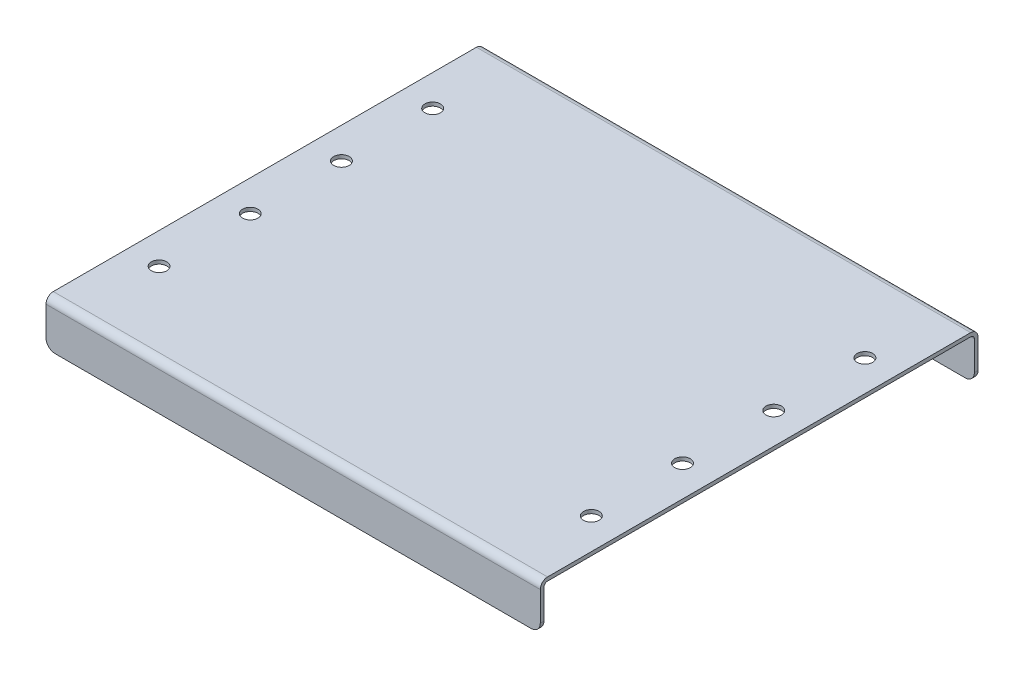
ISO-10303-21;
HEADER;
FILE_DESCRIPTION(('STEP AP214'),'2;1');
FILE_NAME('part.step','',(''),(''),'','','');
FILE_SCHEMA(('AUTOMOTIVE_DESIGN { 1 0 10303 214 1 1 1 1 }'));
ENDSEC;
DATA;
#1=APPLICATION_CONTEXT('core data for automotive mechanical design processes');
#2=APPLICATION_PROTOCOL_DEFINITION('international standard','automotive_design',2000,#1);
#3=PRODUCT_CONTEXT('',#1,'mechanical');
#4=PRODUCT('Part','Part','',(#3));
#5=PRODUCT_RELATED_PRODUCT_CATEGORY('part','',(#4));
#6=PRODUCT_DEFINITION_FORMATION('','',#4);
#7=PRODUCT_DEFINITION_CONTEXT('part definition',#1,'design');
#8=PRODUCT_DEFINITION('design','',#6,#7);
#9=PRODUCT_DEFINITION_SHAPE('','',#8);
#10=(LENGTH_UNIT() NAMED_UNIT(*) SI_UNIT(.MILLI.,.METRE.));
#11=(NAMED_UNIT(*) PLANE_ANGLE_UNIT() SI_UNIT($,.RADIAN.));
#12=(NAMED_UNIT(*) SI_UNIT($,.STERADIAN.) SOLID_ANGLE_UNIT());
#13=UNCERTAINTY_MEASURE_WITH_UNIT(LENGTH_MEASURE(1.E-05),#10,'distance_accuracy_value','');
#14=(GEOMETRIC_REPRESENTATION_CONTEXT(3) GLOBAL_UNCERTAINTY_ASSIGNED_CONTEXT((#13)) GLOBAL_UNIT_ASSIGNED_CONTEXT((#10,
#11,#12)) REPRESENTATION_CONTEXT('',''));
#15=CARTESIAN_POINT('',(0.,0.,0.));
#16=DIRECTION('',(0.,0.,1.));
#17=DIRECTION('',(1.,0.,0.));
#18=AXIS2_PLACEMENT_3D('',#15,#16,#17);
#19=CARTESIAN_POINT('',(0.,4.19953926706038E-13,-118.));
#20=DIRECTION('',(0.,0.,1.));
#21=DIRECTION('',(0.,-1.,0.));
#22=AXIS2_PLACEMENT_3D('',#19,#20,#21);
#23=PLANE('',#22);
#24=DIRECTION('',(0.,1.,0.));
#25=VECTOR('',#24,1.);
#26=CARTESIAN_POINT('',(135.5,-25.,-118.));
#27=LINE('',#26,#25);
#28=CARTESIAN_POINT('',(135.5,-20.,-118.));
#29=VERTEX_POINT('',#28);
#30=CARTESIAN_POINT('',(135.5,-3.99999999999999,-118.));
#31=VERTEX_POINT('',#30);
#32=EDGE_CURVE('E128',#29,#31,#27,.T.);
#33=ORIENTED_EDGE('',*,*,#32,.T.);
#34=DIRECTION('',(1.,0.,0.));
#35=VECTOR('',#34,1.);
#36=CARTESIAN_POINT('',(135.5,-4.,-118.));
#37=LINE('',#36,#35);
#38=CARTESIAN_POINT('',(-135.5,-4.,-118.));
#39=VERTEX_POINT('',#38);
#40=EDGE_CURVE('E271',#31,#39,#37,.F.);
#41=ORIENTED_EDGE('',*,*,#40,.T.);
#42=DIRECTION('',(0.,1.,0.));
#43=VECTOR('',#42,1.);
#44=CARTESIAN_POINT('',(-135.5,-1.99999999999999,-118.));
#45=LINE('',#44,#43);
#46=CARTESIAN_POINT('',(-135.5,-20.,-118.));
#47=VERTEX_POINT('',#46);
#48=EDGE_CURVE('E262',#39,#47,#45,.F.);
#49=ORIENTED_EDGE('',*,*,#48,.T.);
#50=CARTESIAN_POINT('',(-130.5,-20.,-118.));
#51=DIRECTION('',(0.,0.,1.));
#52=DIRECTION('',(0.,-1.,0.));
#53=AXIS2_PLACEMENT_3D('',#50,#51,#52);
#54=CIRCLE('',#53,5.);
#55=CARTESIAN_POINT('',(-130.5,-25.,-118.));
#56=VERTEX_POINT('',#55);
#57=EDGE_CURVE('E136',#56,#47,#54,.F.);
#58=ORIENTED_EDGE('',*,*,#57,.F.);
#59=DIRECTION('',(1.,0.,0.));
#60=VECTOR('',#59,1.);
#61=CARTESIAN_POINT('',(-135.5,-25.,-118.));
#62=LINE('',#61,#60);
#63=CARTESIAN_POINT('',(130.5,-25.,-118.));
#64=VERTEX_POINT('',#63);
#65=EDGE_CURVE('E131',#56,#64,#62,.T.);
#66=ORIENTED_EDGE('',*,*,#65,.T.);
#67=CARTESIAN_POINT('',(130.5,-20.,-118.));
#68=DIRECTION('',(0.,0.,1.));
#69=DIRECTION('',(0.,-1.,0.));
#70=AXIS2_PLACEMENT_3D('',#67,#68,#69);
#71=CIRCLE('',#70,5.);
#72=EDGE_CURVE('E19',#29,#64,#71,.F.);
#73=ORIENTED_EDGE('',*,*,#72,.F.);
#74=EDGE_LOOP('',(#33,#41,#49,#58,#66,#73));
#75=FACE_BOUND('',#74,.T.);
#76=ADVANCED_FACE('F16',(#75),#23,.T.);
#77=CARTESIAN_POINT('',(0.,4.19953926706037E-13,118.));
#78=DIRECTION('',(0.,0.,-1.));
#79=DIRECTION('',(0.,1.,0.));
#80=AXIS2_PLACEMENT_3D('',#77,#78,#79);
#81=PLANE('',#80);
#82=DIRECTION('',(0.,1.,0.));
#83=VECTOR('',#82,1.);
#84=CARTESIAN_POINT('',(-135.5,-25.,118.));
#85=LINE('',#84,#83);
#86=CARTESIAN_POINT('',(-135.5,-20.,118.));
#87=VERTEX_POINT('',#86);
#88=CARTESIAN_POINT('',(-135.5,-3.99999999999999,118.));
#89=VERTEX_POINT('',#88);
#90=EDGE_CURVE('E259',#87,#89,#85,.T.);
#91=ORIENTED_EDGE('',*,*,#90,.T.);
#92=DIRECTION('',(-1.,0.,0.));
#93=VECTOR('',#92,1.);
#94=CARTESIAN_POINT('',(-135.5,-3.99999999999999,118.));
#95=LINE('',#94,#93);
#96=CARTESIAN_POINT('',(135.5,-3.99999999999998,118.));
#97=VERTEX_POINT('',#96);
#98=EDGE_CURVE('E245',#89,#97,#95,.F.);
#99=ORIENTED_EDGE('',*,*,#98,.T.);
#100=DIRECTION('',(0.,1.,0.));
#101=VECTOR('',#100,1.);
#102=CARTESIAN_POINT('',(135.5,-1.99999999999999,118.));
#103=LINE('',#102,#101);
#104=CARTESIAN_POINT('',(135.5,-20.,118.));
#105=VERTEX_POINT('',#104);
#106=EDGE_CURVE('E159',#97,#105,#103,.F.);
#107=ORIENTED_EDGE('',*,*,#106,.T.);
#108=CARTESIAN_POINT('',(130.5,-20.,118.));
#109=DIRECTION('',(0.,0.,-1.));
#110=DIRECTION('',(0.,1.,0.));
#111=AXIS2_PLACEMENT_3D('',#108,#109,#110);
#112=CIRCLE('',#111,5.);
#113=CARTESIAN_POINT('',(130.5,-25.,118.));
#114=VERTEX_POINT('',#113);
#115=EDGE_CURVE('E246',#114,#105,#112,.F.);
#116=ORIENTED_EDGE('',*,*,#115,.F.);
#117=DIRECTION('',(1.,0.,0.));
#118=VECTOR('',#117,1.);
#119=CARTESIAN_POINT('',(135.5,-25.,118.));
#120=LINE('',#119,#118);
#121=CARTESIAN_POINT('',(-130.5,-25.,118.));
#122=VERTEX_POINT('',#121);
#123=EDGE_CURVE('E157',#114,#122,#120,.F.);
#124=ORIENTED_EDGE('',*,*,#123,.T.);
#125=CARTESIAN_POINT('',(-130.5,-20.,118.));
#126=DIRECTION('',(0.,0.,-1.));
#127=DIRECTION('',(0.,1.,0.));
#128=AXIS2_PLACEMENT_3D('',#125,#126,#127);
#129=CIRCLE('',#128,5.);
#130=EDGE_CURVE('E145',#87,#122,#129,.F.);
#131=ORIENTED_EDGE('',*,*,#130,.F.);
#132=EDGE_LOOP('',(#91,#99,#107,#116,#124,#131));
#133=FACE_BOUND('',#132,.T.);
#134=ADVANCED_FACE('F316',(#133),#81,.T.);
#135=CARTESIAN_POINT('',(130.5,-20.,-120.));
#136=DIRECTION('',(0.,0.,1.));
#137=DIRECTION('',(0.,-1.,0.));
#138=AXIS2_PLACEMENT_3D('',#135,#136,#137);
#139=CYLINDRICAL_SURFACE('',#138,5.);
#140=ORIENTED_EDGE('',*,*,#72,.T.);
#141=DIRECTION('',(0.,0.,1.));
#142=VECTOR('',#141,1.);
#143=CARTESIAN_POINT('',(130.5,-25.,-120.));
#144=LINE('',#143,#142);
#145=CARTESIAN_POINT('',(130.5,-25.,-120.));
#146=VERTEX_POINT('',#145);
#147=EDGE_CURVE('E249',#64,#146,#144,.F.);
#148=ORIENTED_EDGE('',*,*,#147,.T.);
#149=CARTESIAN_POINT('',(130.5,-20.,-120.));
#150=DIRECTION('',(0.,0.,1.));
#151=DIRECTION('',(0.,-1.,0.));
#152=AXIS2_PLACEMENT_3D('',#149,#150,#151);
#153=CIRCLE('',#152,5.);
#154=CARTESIAN_POINT('',(135.5,-20.,-120.));
#155=VERTEX_POINT('',#154);
#156=EDGE_CURVE('E149',#146,#155,#153,.T.);
#157=ORIENTED_EDGE('',*,*,#156,.T.);
#158=DIRECTION('',(0.,0.,1.));
#159=VECTOR('',#158,1.);
#160=CARTESIAN_POINT('',(135.5,-20.,-120.));
#161=LINE('',#160,#159);
#162=EDGE_CURVE('E141',#155,#29,#161,.T.);
#163=ORIENTED_EDGE('',*,*,#162,.T.);
#164=EDGE_LOOP('',(#140,#148,#157,#163));
#165=FACE_BOUND('',#164,.T.);
#166=ADVANCED_FACE('F148',(#165),#139,.T.);
#167=CARTESIAN_POINT('',(-130.5,-20.,-120.));
#168=DIRECTION('',(0.,0.,1.));
#169=DIRECTION('',(0.,-1.,0.));
#170=AXIS2_PLACEMENT_3D('',#167,#168,#169);
#171=CYLINDRICAL_SURFACE('',#170,5.);
#172=ORIENTED_EDGE('',*,*,#57,.T.);
#173=DIRECTION('',(0.,0.,-1.));
#174=VECTOR('',#173,1.);
#175=CARTESIAN_POINT('',(-135.5,-20.,-120.));
#176=LINE('',#175,#174);
#177=CARTESIAN_POINT('',(-135.5,-20.,-120.));
#178=VERTEX_POINT('',#177);
#179=EDGE_CURVE('E155',#47,#178,#176,.T.);
#180=ORIENTED_EDGE('',*,*,#179,.T.);
#181=CARTESIAN_POINT('',(-130.5,-20.,-120.));
#182=DIRECTION('',(0.,0.,1.));
#183=DIRECTION('',(0.,-1.,0.));
#184=AXIS2_PLACEMENT_3D('',#181,#182,#183);
#185=CIRCLE('',#184,5.);
#186=CARTESIAN_POINT('',(-130.5,-25.,-120.));
#187=VERTEX_POINT('',#186);
#188=EDGE_CURVE('E239',#178,#187,#185,.T.);
#189=ORIENTED_EDGE('',*,*,#188,.T.);
#190=DIRECTION('',(0.,0.,1.));
#191=VECTOR('',#190,1.);
#192=CARTESIAN_POINT('',(-130.5,-25.,-120.));
#193=LINE('',#192,#191);
#194=EDGE_CURVE('E151',#187,#56,#193,.T.);
#195=ORIENTED_EDGE('',*,*,#194,.T.);
#196=EDGE_LOOP('',(#172,#180,#189,#195));
#197=FACE_BOUND('',#196,.T.);
#198=ADVANCED_FACE('F345',(#197),#171,.T.);
#199=CARTESIAN_POINT('',(-135.5,-25.,-120.));
#200=DIRECTION('',(0.,1.,0.));
#201=DIRECTION('',(0.,0.,1.));
#202=AXIS2_PLACEMENT_3D('',#199,#200,#201);
#203=PLANE('',#202);
#204=ORIENTED_EDGE('',*,*,#194,.F.);
#205=DIRECTION('',(1.,0.,0.));
#206=VECTOR('',#205,1.);
#207=CARTESIAN_POINT('',(0.,-25.,-120.));
#208=LINE('',#207,#206);
#209=EDGE_CURVE('E238',#187,#146,#208,.T.);
#210=ORIENTED_EDGE('',*,*,#209,.T.);
#211=ORIENTED_EDGE('',*,*,#147,.F.);
#212=ORIENTED_EDGE('',*,*,#65,.F.);
#213=EDGE_LOOP('',(#204,#210,#211,#212));
#214=FACE_BOUND('',#213,.T.);
#215=ADVANCED_FACE('F347',(#214),#203,.F.);
#216=CARTESIAN_POINT('',(-130.5,-20.,120.));
#217=DIRECTION('',(0.,0.,-1.));
#218=DIRECTION('',(0.,1.,0.));
#219=AXIS2_PLACEMENT_3D('',#216,#217,#218);
#220=CYLINDRICAL_SURFACE('',#219,5.);
#221=ORIENTED_EDGE('',*,*,#130,.T.);
#222=DIRECTION('',(0.,0.,1.));
#223=VECTOR('',#222,1.);
#224=CARTESIAN_POINT('',(-130.5,-25.,120.));
#225=LINE('',#224,#223);
#226=CARTESIAN_POINT('',(-130.5,-25.,120.));
#227=VERTEX_POINT('',#226);
#228=EDGE_CURVE('E248',#122,#227,#225,.T.);
#229=ORIENTED_EDGE('',*,*,#228,.T.);
#230=CARTESIAN_POINT('',(-130.5,-20.,120.));
#231=DIRECTION('',(0.,0.,-1.));
#232=DIRECTION('',(0.,1.,0.));
#233=AXIS2_PLACEMENT_3D('',#230,#231,#232);
#234=CIRCLE('',#233,5.);
#235=CARTESIAN_POINT('',(-135.5,-20.,120.));
#236=VERTEX_POINT('',#235);
#237=EDGE_CURVE('E233',#227,#236,#234,.T.);
#238=ORIENTED_EDGE('',*,*,#237,.T.);
#239=DIRECTION('',(0.,0.,-1.));
#240=VECTOR('',#239,1.);
#241=CARTESIAN_POINT('',(-135.5,-20.,120.));
#242=LINE('',#241,#240);
#243=EDGE_CURVE('E256',#236,#87,#242,.T.);
#244=ORIENTED_EDGE('',*,*,#243,.T.);
#245=EDGE_LOOP('',(#221,#229,#238,#244));
#246=FACE_BOUND('',#245,.T.);
#247=ADVANCED_FACE('F319',(#246),#220,.T.);
#248=CARTESIAN_POINT('',(130.5,-20.,120.));
#249=DIRECTION('',(0.,0.,-1.));
#250=DIRECTION('',(0.,1.,0.));
#251=AXIS2_PLACEMENT_3D('',#248,#249,#250);
#252=CYLINDRICAL_SURFACE('',#251,5.);
#253=ORIENTED_EDGE('',*,*,#115,.T.);
#254=DIRECTION('',(0.,0.,1.));
#255=VECTOR('',#254,1.);
#256=CARTESIAN_POINT('',(135.5,-20.,120.));
#257=LINE('',#256,#255);
#258=CARTESIAN_POINT('',(135.5,-20.,120.));
#259=VERTEX_POINT('',#258);
#260=EDGE_CURVE('E260',#105,#259,#257,.T.);
#261=ORIENTED_EDGE('',*,*,#260,.T.);
#262=CARTESIAN_POINT('',(130.5,-20.,120.));
#263=DIRECTION('',(0.,0.,-1.));
#264=DIRECTION('',(0.,1.,0.));
#265=AXIS2_PLACEMENT_3D('',#262,#263,#264);
#266=CIRCLE('',#265,5.);
#267=CARTESIAN_POINT('',(130.5,-25.,120.));
#268=VERTEX_POINT('',#267);
#269=EDGE_CURVE('E229',#259,#268,#266,.T.);
#270=ORIENTED_EDGE('',*,*,#269,.T.);
#271=DIRECTION('',(0.,0.,1.));
#272=VECTOR('',#271,1.);
#273=CARTESIAN_POINT('',(130.5,-25.,120.));
#274=LINE('',#273,#272);
#275=EDGE_CURVE('E160',#268,#114,#274,.F.);
#276=ORIENTED_EDGE('',*,*,#275,.T.);
#277=EDGE_LOOP('',(#253,#261,#270,#276));
#278=FACE_BOUND('',#277,.T.);
#279=ADVANCED_FACE('F355',(#278),#252,.T.);
#280=CARTESIAN_POINT('',(135.5,-25.,120.));
#281=DIRECTION('',(0.,1.,0.));
#282=DIRECTION('',(0.,0.,1.));
#283=AXIS2_PLACEMENT_3D('',#280,#281,#282);
#284=PLANE('',#283);
#285=ORIENTED_EDGE('',*,*,#275,.F.);
#286=DIRECTION('',(1.,0.,0.));
#287=VECTOR('',#286,1.);
#288=CARTESIAN_POINT('',(0.,-25.,120.));
#289=LINE('',#288,#287);
#290=EDGE_CURVE('E228',#268,#227,#289,.F.);
#291=ORIENTED_EDGE('',*,*,#290,.T.);
#292=ORIENTED_EDGE('',*,*,#228,.F.);
#293=ORIENTED_EDGE('',*,*,#123,.F.);
#294=EDGE_LOOP('',(#285,#291,#292,#293));
#295=FACE_BOUND('',#294,.T.);
#296=ADVANCED_FACE('F419',(#295),#284,.F.);
#297=CARTESIAN_POINT('',(135.5,-4.,-116.));
#298=DIRECTION('',(1.,0.,0.));
#299=DIRECTION('',(0.,0.,-1.));
#300=AXIS2_PLACEMENT_3D('',#297,#298,#299);
#301=CYLINDRICAL_SURFACE('',#300,1.99999999999997);
#302=CARTESIAN_POINT('',(-135.5,-4.,-116.));
#303=DIRECTION('',(1.,0.,0.));
#304=DIRECTION('',(0.,0.,-1.));
#305=AXIS2_PLACEMENT_3D('',#302,#303,#304);
#306=CIRCLE('',#305,1.99999999999997);
#307=CARTESIAN_POINT('',(-135.5,-2.00000000000001,-116.));
#308=VERTEX_POINT('',#307);
#309=EDGE_CURVE('E224',#39,#308,#306,.T.);
#310=ORIENTED_EDGE('',*,*,#309,.F.);
#311=ORIENTED_EDGE('',*,*,#40,.F.);
#312=CARTESIAN_POINT('',(135.5,-4.,-116.));
#313=DIRECTION('',(1.,0.,0.));
#314=DIRECTION('',(0.,0.,-1.));
#315=AXIS2_PLACEMENT_3D('',#312,#313,#314);
#316=CIRCLE('',#315,1.99999999999997);
#317=CARTESIAN_POINT('',(135.5,-2.00000000000001,-116.));
#318=VERTEX_POINT('',#317);
#319=EDGE_CURVE('E144',#31,#318,#316,.T.);
#320=ORIENTED_EDGE('',*,*,#319,.T.);
#321=DIRECTION('',(1.,0.,0.));
#322=VECTOR('',#321,1.);
#323=CARTESIAN_POINT('',(0.,-2.,-116.));
#324=LINE('',#323,#322);
#325=EDGE_CURVE('E223',#308,#318,#324,.T.);
#326=ORIENTED_EDGE('',*,*,#325,.F.);
#327=EDGE_LOOP('',(#310,#311,#320,#326));
#328=FACE_BOUND('',#327,.T.);
#329=ADVANCED_FACE('F416',(#328),#301,.F.);
#330=CARTESIAN_POINT('',(-135.5,-3.99999999999999,116.));
#331=DIRECTION('',(-1.,0.,0.));
#332=DIRECTION('',(0.,0.,1.));
#333=AXIS2_PLACEMENT_3D('',#330,#331,#332);
#334=CYLINDRICAL_SURFACE('',#333,1.99999999999997);
#335=CARTESIAN_POINT('',(135.5,-3.99999999999999,116.));
#336=DIRECTION('',(-1.,0.,0.));
#337=DIRECTION('',(0.,0.,1.));
#338=AXIS2_PLACEMENT_3D('',#335,#336,#337);
#339=CIRCLE('',#338,1.99999999999997);
#340=CARTESIAN_POINT('',(135.5,-2.00000000000001,116.));
#341=VERTEX_POINT('',#340);
#342=EDGE_CURVE('E226',#97,#341,#339,.T.);
#343=ORIENTED_EDGE('',*,*,#342,.F.);
#344=ORIENTED_EDGE('',*,*,#98,.F.);
#345=CARTESIAN_POINT('',(-135.5,-3.99999999999999,116.));
#346=DIRECTION('',(-1.,0.,0.));
#347=DIRECTION('',(0.,0.,1.));
#348=AXIS2_PLACEMENT_3D('',#345,#346,#347);
#349=CIRCLE('',#348,1.99999999999997);
#350=CARTESIAN_POINT('',(-135.5,-2.00000000000001,116.));
#351=VERTEX_POINT('',#350);
#352=EDGE_CURVE('E220',#89,#351,#349,.T.);
#353=ORIENTED_EDGE('',*,*,#352,.T.);
#354=DIRECTION('',(1.,0.,0.));
#355=VECTOR('',#354,1.);
#356=CARTESIAN_POINT('',(0.,-2.,116.));
#357=LINE('',#356,#355);
#358=EDGE_CURVE('E219',#341,#351,#357,.F.);
#359=ORIENTED_EDGE('',*,*,#358,.F.);
#360=EDGE_LOOP('',(#343,#344,#353,#359));
#361=FACE_BOUND('',#360,.T.);
#362=ADVANCED_FACE('F313',(#361),#334,.F.);
#363=CARTESIAN_POINT('',(0.,4.26936889383724E-13,-120.));
#364=DIRECTION('',(0.,0.,1.));
#365=DIRECTION('',(0.,-1.,0.));
#366=AXIS2_PLACEMENT_3D('',#363,#364,#365);
#367=PLANE('',#366);
#368=ORIENTED_EDGE('',*,*,#188,.F.);
#369=DIRECTION('',(0.,-1.,0.));
#370=VECTOR('',#369,1.);
#371=CARTESIAN_POINT('',(-135.5,4.26936889383724E-13,-120.));
#372=LINE('',#371,#370);
#373=CARTESIAN_POINT('',(-135.5,-4.,-120.));
#374=VERTEX_POINT('',#373);
#375=EDGE_CURVE('E242',#374,#178,#372,.T.);
#376=ORIENTED_EDGE('',*,*,#375,.F.);
#377=DIRECTION('',(1.,0.,0.));
#378=VECTOR('',#377,1.);
#379=CARTESIAN_POINT('',(135.5,-4.,-120.));
#380=LINE('',#379,#378);
#381=CARTESIAN_POINT('',(135.5,-3.99999999999999,-120.));
#382=VERTEX_POINT('',#381);
#383=EDGE_CURVE('E204',#382,#374,#380,.F.);
#384=ORIENTED_EDGE('',*,*,#383,.F.);
#385=DIRECTION('',(0.,-1.,0.));
#386=VECTOR('',#385,1.);
#387=CARTESIAN_POINT('',(135.5,4.26936889383724E-13,-120.));
#388=LINE('',#387,#386);
#389=EDGE_CURVE('E244',#155,#382,#388,.F.);
#390=ORIENTED_EDGE('',*,*,#389,.F.);
#391=ORIENTED_EDGE('',*,*,#156,.F.);
#392=ORIENTED_EDGE('',*,*,#209,.F.);
#393=EDGE_LOOP('',(#368,#376,#384,#390,#391,#392));
#394=FACE_BOUND('',#393,.T.);
#395=ADVANCED_FACE('F343',(#394),#367,.F.);
#396=CARTESIAN_POINT('',(0.,4.26936889383723E-13,120.));
#397=DIRECTION('',(0.,0.,-1.));
#398=DIRECTION('',(0.,1.,0.));
#399=AXIS2_PLACEMENT_3D('',#396,#397,#398);
#400=PLANE('',#399);
#401=ORIENTED_EDGE('',*,*,#269,.F.);
#402=DIRECTION('',(0.,1.,0.));
#403=VECTOR('',#402,1.);
#404=CARTESIAN_POINT('',(135.5,4.26936889383723E-13,120.));
#405=LINE('',#404,#403);
#406=CARTESIAN_POINT('',(135.5,-3.99999999999998,120.));
#407=VERTEX_POINT('',#406);
#408=EDGE_CURVE('E232',#407,#259,#405,.F.);
#409=ORIENTED_EDGE('',*,*,#408,.F.);
#410=DIRECTION('',(-1.,0.,0.));
#411=VECTOR('',#410,1.);
#412=CARTESIAN_POINT('',(-135.5,-3.99999999999999,120.));
#413=LINE('',#412,#411);
#414=CARTESIAN_POINT('',(-135.5,-3.99999999999998,120.));
#415=VERTEX_POINT('',#414);
#416=EDGE_CURVE('E199',#415,#407,#413,.F.);
#417=ORIENTED_EDGE('',*,*,#416,.F.);
#418=DIRECTION('',(0.,1.,0.));
#419=VECTOR('',#418,1.);
#420=CARTESIAN_POINT('',(-135.5,4.26936889383724E-13,120.));
#421=LINE('',#420,#419);
#422=EDGE_CURVE('E236',#236,#415,#421,.T.);
#423=ORIENTED_EDGE('',*,*,#422,.F.);
#424=ORIENTED_EDGE('',*,*,#237,.F.);
#425=ORIENTED_EDGE('',*,*,#290,.F.);
#426=EDGE_LOOP('',(#401,#409,#417,#423,#424,#425));
#427=FACE_BOUND('',#426,.T.);
#428=ADVANCED_FACE('F324',(#427),#400,.F.);
#429=CARTESIAN_POINT('',(0.,-2.,0.));
#430=DIRECTION('',(0.,-1.,0.));
#431=DIRECTION('',(0.,0.,-1.));
#432=AXIS2_PLACEMENT_3D('',#429,#430,#431);
#433=PLANE('',#432);
#434=CARTESIAN_POINT('',(118.5,-2.,75.));
#435=DIRECTION('',(0.,1.,0.));
#436=DIRECTION('',(0.,0.,1.));
#437=AXIS2_PLACEMENT_3D('',#434,#435,#436);
#438=CIRCLE('',#437,4.25);
#439=CARTESIAN_POINT('',(118.5,-2.,79.25));
#440=VERTEX_POINT('',#439);
#441=EDGE_CURVE('E184',#440,#440,#438,.T.);
#442=ORIENTED_EDGE('',*,*,#441,.T.);
#443=EDGE_LOOP('',(#442));
#444=FACE_BOUND('',#443,.T.);
#445=CARTESIAN_POINT('',(118.5,-2.,-25.));
#446=DIRECTION('',(0.,1.,0.));
#447=DIRECTION('',(0.,0.,1.));
#448=AXIS2_PLACEMENT_3D('',#445,#446,#447);
#449=CIRCLE('',#448,4.24999999999995);
#450=CARTESIAN_POINT('',(118.5,-2.,-20.7500000000001));
#451=VERTEX_POINT('',#450);
#452=EDGE_CURVE('E190',#451,#451,#449,.T.);
#453=ORIENTED_EDGE('',*,*,#452,.T.);
#454=EDGE_LOOP('',(#453));
#455=FACE_BOUND('',#454,.T.);
#456=DIRECTION('',(0.,0.,-1.));
#457=VECTOR('',#456,1.);
#458=CARTESIAN_POINT('',(135.5,-2.00000000000002,-116.));
#459=LINE('',#458,#457);
#460=EDGE_CURVE('E201',#341,#318,#459,.T.);
#461=ORIENTED_EDGE('',*,*,#460,.F.);
#462=ORIENTED_EDGE('',*,*,#358,.T.);
#463=DIRECTION('',(0.,0.,1.));
#464=VECTOR('',#463,1.);
#465=CARTESIAN_POINT('',(-135.5,-2.00000000000003,-116.));
#466=LINE('',#465,#464);
#467=EDGE_CURVE('E196',#308,#351,#466,.T.);
#468=ORIENTED_EDGE('',*,*,#467,.F.);
#469=ORIENTED_EDGE('',*,*,#325,.T.);
#470=EDGE_LOOP('',(#461,#462,#468,#469));
#471=FACE_BOUND('',#470,.T.);
#472=CARTESIAN_POINT('',(-118.5,-2.,25.));
#473=DIRECTION('',(0.,1.,0.));
#474=DIRECTION('',(0.,0.,1.));
#475=AXIS2_PLACEMENT_3D('',#472,#473,#474);
#476=CIRCLE('',#475,4.24999999999995);
#477=CARTESIAN_POINT('',(-118.5,-2.,29.25));
#478=VERTEX_POINT('',#477);
#479=EDGE_CURVE('E207',#478,#478,#476,.T.);
#480=ORIENTED_EDGE('',*,*,#479,.T.);
#481=EDGE_LOOP('',(#480));
#482=FACE_BOUND('',#481,.T.);
#483=CARTESIAN_POINT('',(-118.5,-2.,-25.));
#484=DIRECTION('',(0.,1.,0.));
#485=DIRECTION('',(0.,0.,1.));
#486=AXIS2_PLACEMENT_3D('',#483,#484,#485);
#487=CIRCLE('',#486,4.24999999999995);
#488=CARTESIAN_POINT('',(-118.5,-2.,-20.7500000000001));
#489=VERTEX_POINT('',#488);
#490=EDGE_CURVE('E210',#489,#489,#487,.T.);
#491=ORIENTED_EDGE('',*,*,#490,.T.);
#492=EDGE_LOOP('',(#491));
#493=FACE_BOUND('',#492,.T.);
#494=CARTESIAN_POINT('',(-118.5,-2.,-75.));
#495=DIRECTION('',(0.,1.,0.));
#496=DIRECTION('',(0.,0.,1.));
#497=AXIS2_PLACEMENT_3D('',#494,#495,#496);
#498=CIRCLE('',#497,4.25);
#499=CARTESIAN_POINT('',(-118.5,-2.,-70.75));
#500=VERTEX_POINT('',#499);
#501=EDGE_CURVE('E213',#500,#500,#498,.T.);
#502=ORIENTED_EDGE('',*,*,#501,.T.);
#503=EDGE_LOOP('',(#502));
#504=FACE_BOUND('',#503,.T.);
#505=CARTESIAN_POINT('',(-118.5,-2.,75.));
#506=DIRECTION('',(0.,1.,0.));
#507=DIRECTION('',(0.,0.,1.));
#508=AXIS2_PLACEMENT_3D('',#505,#506,#507);
#509=CIRCLE('',#508,4.25);
#510=CARTESIAN_POINT('',(-118.5,-2.,79.25));
#511=VERTEX_POINT('',#510);
#512=EDGE_CURVE('E216',#511,#511,#509,.T.);
#513=ORIENTED_EDGE('',*,*,#512,.T.);
#514=EDGE_LOOP('',(#513));
#515=FACE_BOUND('',#514,.T.);
#516=CARTESIAN_POINT('',(118.5,-2.,25.));
#517=DIRECTION('',(0.,1.,0.));
#518=DIRECTION('',(0.,0.,1.));
#519=AXIS2_PLACEMENT_3D('',#516,#517,#518);
#520=CIRCLE('',#519,4.24999999999995);
#521=CARTESIAN_POINT('',(118.5,-2.,29.25));
#522=VERTEX_POINT('',#521);
#523=EDGE_CURVE('E193',#522,#522,#520,.T.);
#524=ORIENTED_EDGE('',*,*,#523,.T.);
#525=EDGE_LOOP('',(#524));
#526=FACE_BOUND('',#525,.T.);
#527=CARTESIAN_POINT('',(118.5,-2.,-75.));
#528=DIRECTION('',(0.,1.,0.));
#529=DIRECTION('',(0.,0.,1.));
#530=AXIS2_PLACEMENT_3D('',#527,#528,#529);
#531=CIRCLE('',#530,4.25);
#532=CARTESIAN_POINT('',(118.5,-2.,-70.75));
#533=VERTEX_POINT('',#532);
#534=EDGE_CURVE('E187',#533,#533,#531,.T.);
#535=ORIENTED_EDGE('',*,*,#534,.T.);
#536=EDGE_LOOP('',(#535));
#537=FACE_BOUND('',#536,.T.);
#538=ADVANCED_FACE('F405',(#444,#455,#471,#482,#493,#504,#515,#526,#537),#433,.T.);
#539=CARTESIAN_POINT('',(-118.5,-25.001,75.));
#540=DIRECTION('',(0.,1.,0.));
#541=DIRECTION('',(0.,0.,1.));
#542=AXIS2_PLACEMENT_3D('',#539,#540,#541);
#543=CYLINDRICAL_SURFACE('',#542,4.25);
#544=ORIENTED_EDGE('',*,*,#512,.F.);
#545=EDGE_LOOP('',(#544));
#546=FACE_BOUND('',#545,.T.);
#547=CARTESIAN_POINT('',(-118.5,0.,75.));
#548=DIRECTION('',(0.,1.,0.));
#549=DIRECTION('',(0.,0.,1.));
#550=AXIS2_PLACEMENT_3D('',#547,#548,#549);
#551=CIRCLE('',#550,4.25);
#552=CARTESIAN_POINT('',(-118.5,0.,79.25));
#553=VERTEX_POINT('',#552);
#554=EDGE_CURVE('E181',#553,#553,#551,.T.);
#555=ORIENTED_EDGE('',*,*,#554,.T.);
#556=EDGE_LOOP('',(#555));
#557=FACE_BOUND('',#556,.T.);
#558=ADVANCED_FACE('F401',(#546,#557),#543,.F.);
#559=CARTESIAN_POINT('',(-118.5,-25.001,-75.));
#560=DIRECTION('',(0.,1.,0.));
#561=DIRECTION('',(0.,0.,1.));
#562=AXIS2_PLACEMENT_3D('',#559,#560,#561);
#563=CYLINDRICAL_SURFACE('',#562,4.25);
#564=ORIENTED_EDGE('',*,*,#501,.F.);
#565=EDGE_LOOP('',(#564));
#566=FACE_BOUND('',#565,.T.);
#567=CARTESIAN_POINT('',(-118.5,0.,-75.));
#568=DIRECTION('',(0.,1.,0.));
#569=DIRECTION('',(0.,0.,1.));
#570=AXIS2_PLACEMENT_3D('',#567,#568,#569);
#571=CIRCLE('',#570,4.25);
#572=CARTESIAN_POINT('',(-118.5,0.,-70.75));
#573=VERTEX_POINT('',#572);
#574=EDGE_CURVE('E178',#573,#573,#571,.T.);
#575=ORIENTED_EDGE('',*,*,#574,.T.);
#576=EDGE_LOOP('',(#575));
#577=FACE_BOUND('',#576,.T.);
#578=ADVANCED_FACE('F397',(#566,#577),#563,.F.);
#579=CARTESIAN_POINT('',(-118.5,-25.001,-25.));
#580=DIRECTION('',(0.,1.,0.));
#581=DIRECTION('',(0.,0.,1.));
#582=AXIS2_PLACEMENT_3D('',#579,#580,#581);
#583=CYLINDRICAL_SURFACE('',#582,4.24999999999995);
#584=ORIENTED_EDGE('',*,*,#490,.F.);
#585=EDGE_LOOP('',(#584));
#586=FACE_BOUND('',#585,.T.);
#587=CARTESIAN_POINT('',(-118.5,0.,-25.));
#588=DIRECTION('',(0.,1.,0.));
#589=DIRECTION('',(0.,0.,1.));
#590=AXIS2_PLACEMENT_3D('',#587,#588,#589);
#591=CIRCLE('',#590,4.24999999999995);
#592=CARTESIAN_POINT('',(-118.5,0.,-20.7500000000001));
#593=VERTEX_POINT('',#592);
#594=EDGE_CURVE('E175',#593,#593,#591,.T.);
#595=ORIENTED_EDGE('',*,*,#594,.T.);
#596=EDGE_LOOP('',(#595));
#597=FACE_BOUND('',#596,.T.);
#598=ADVANCED_FACE('F393',(#586,#597),#583,.F.);
#599=CARTESIAN_POINT('',(-118.5,-25.001,25.));
#600=DIRECTION('',(0.,1.,0.));
#601=DIRECTION('',(0.,0.,1.));
#602=AXIS2_PLACEMENT_3D('',#599,#600,#601);
#603=CYLINDRICAL_SURFACE('',#602,4.24999999999995);
#604=ORIENTED_EDGE('',*,*,#479,.F.);
#605=EDGE_LOOP('',(#604));
#606=FACE_BOUND('',#605,.T.);
#607=CARTESIAN_POINT('',(-118.5,0.,25.));
#608=DIRECTION('',(0.,1.,0.));
#609=DIRECTION('',(0.,0.,1.));
#610=AXIS2_PLACEMENT_3D('',#607,#608,#609);
#611=CIRCLE('',#610,4.24999999999995);
#612=CARTESIAN_POINT('',(-118.5,0.,29.25));
#613=VERTEX_POINT('',#612);
#614=EDGE_CURVE('E171',#613,#613,#611,.T.);
#615=ORIENTED_EDGE('',*,*,#614,.T.);
#616=EDGE_LOOP('',(#615));
#617=FACE_BOUND('',#616,.T.);
#618=ADVANCED_FACE('F390',(#606,#617),#603,.F.);
#619=CARTESIAN_POINT('',(135.5,-4.,-116.));
#620=DIRECTION('',(1.,0.,0.));
#621=DIRECTION('',(0.,0.,-1.));
#622=AXIS2_PLACEMENT_3D('',#619,#620,#621);
#623=CYLINDRICAL_SURFACE('',#622,3.99999999999998);
#624=ORIENTED_EDGE('',*,*,#383,.T.);
#625=CARTESIAN_POINT('',(-135.5,-4.,-116.));
#626=DIRECTION('',(1.,0.,0.));
#627=DIRECTION('',(0.,0.,-1.));
#628=AXIS2_PLACEMENT_3D('',#625,#626,#627);
#629=CIRCLE('',#628,3.99999999999998);
#630=CARTESIAN_POINT('',(-135.5,0.,-116.));
#631=VERTEX_POINT('',#630);
#632=EDGE_CURVE('E202',#374,#631,#629,.T.);
#633=ORIENTED_EDGE('',*,*,#632,.T.);
#634=DIRECTION('',(1.,0.,0.));
#635=VECTOR('',#634,1.);
#636=CARTESIAN_POINT('',(0.,0.,-116.));
#637=LINE('',#636,#635);
#638=CARTESIAN_POINT('',(135.5,0.,-116.));
#639=VERTEX_POINT('',#638);
#640=EDGE_CURVE('E174',#631,#639,#637,.T.);
#641=ORIENTED_EDGE('',*,*,#640,.T.);
#642=CARTESIAN_POINT('',(135.5,-4.,-116.));
#643=DIRECTION('',(1.,0.,0.));
#644=DIRECTION('',(0.,0.,-1.));
#645=AXIS2_PLACEMENT_3D('',#642,#643,#644);
#646=CIRCLE('',#645,3.99999999999998);
#647=EDGE_CURVE('E205',#639,#382,#646,.F.);
#648=ORIENTED_EDGE('',*,*,#647,.T.);
#649=EDGE_LOOP('',(#624,#633,#641,#648));
#650=FACE_BOUND('',#649,.T.);
#651=ADVANCED_FACE('F338',(#650),#623,.T.);
#652=CARTESIAN_POINT('',(135.5,-2.,-116.));
#653=DIRECTION('',(1.,0.,0.));
#654=DIRECTION('',(0.,0.,-1.));
#655=AXIS2_PLACEMENT_3D('',#652,#653,#654);
#656=PLANE('',#655);
#657=ORIENTED_EDGE('',*,*,#460,.T.);
#658=ORIENTED_EDGE('',*,*,#319,.F.);
#659=ORIENTED_EDGE('',*,*,#32,.F.);
#660=ORIENTED_EDGE('',*,*,#162,.F.);
#661=ORIENTED_EDGE('',*,*,#389,.T.);
#662=ORIENTED_EDGE('',*,*,#647,.F.);
#663=DIRECTION('',(0.,0.,-1.));
#664=VECTOR('',#663,1.);
#665=CARTESIAN_POINT('',(135.5,0.,0.));
#666=LINE('',#665,#664);
#667=CARTESIAN_POINT('',(135.5,0.,116.));
#668=VERTEX_POINT('',#667);
#669=EDGE_CURVE('E289',#639,#668,#666,.F.);
#670=ORIENTED_EDGE('',*,*,#669,.T.);
#671=CARTESIAN_POINT('',(135.5,-3.99999999999999,116.));
#672=DIRECTION('',(-1.,0.,0.));
#673=DIRECTION('',(0.,0.,1.));
#674=AXIS2_PLACEMENT_3D('',#671,#672,#673);
#675=CIRCLE('',#674,3.99999999999998);
#676=EDGE_CURVE('E197',#407,#668,#675,.T.);
#677=ORIENTED_EDGE('',*,*,#676,.F.);
#678=ORIENTED_EDGE('',*,*,#408,.T.);
#679=ORIENTED_EDGE('',*,*,#260,.F.);
#680=ORIENTED_EDGE('',*,*,#106,.F.);
#681=ORIENTED_EDGE('',*,*,#342,.T.);
#682=EDGE_LOOP('',(#657,#658,#659,#660,#661,#662,#670,#677,#678,#679,#680,#681));
#683=FACE_BOUND('',#682,.T.);
#684=ADVANCED_FACE('F139',(#683),#656,.T.);
#685=CARTESIAN_POINT('',(-135.5,-3.99999999999999,116.));
#686=DIRECTION('',(-1.,0.,0.));
#687=DIRECTION('',(0.,0.,1.));
#688=AXIS2_PLACEMENT_3D('',#685,#686,#687);
#689=CYLINDRICAL_SURFACE('',#688,3.99999999999998);
#690=ORIENTED_EDGE('',*,*,#416,.T.);
#691=ORIENTED_EDGE('',*,*,#676,.T.);
#692=DIRECTION('',(1.,0.,0.));
#693=VECTOR('',#692,1.);
#694=CARTESIAN_POINT('',(0.,0.,116.));
#695=LINE('',#694,#693);
#696=CARTESIAN_POINT('',(-135.5,0.,116.));
#697=VERTEX_POINT('',#696);
#698=EDGE_CURVE('E292',#668,#697,#695,.F.);
#699=ORIENTED_EDGE('',*,*,#698,.T.);
#700=CARTESIAN_POINT('',(-135.5,-3.99999999999999,116.));
#701=DIRECTION('',(-1.,0.,0.));
#702=DIRECTION('',(0.,0.,1.));
#703=AXIS2_PLACEMENT_3D('',#700,#701,#702);
#704=CIRCLE('',#703,3.99999999999998);
#705=EDGE_CURVE('E34',#697,#415,#704,.F.);
#706=ORIENTED_EDGE('',*,*,#705,.T.);
#707=EDGE_LOOP('',(#690,#691,#699,#706));
#708=FACE_BOUND('',#707,.T.);
#709=ADVANCED_FACE('F329',(#708),#689,.T.);
#710=CARTESIAN_POINT('',(-135.5,-2.,-116.));
#711=DIRECTION('',(-1.,0.,0.));
#712=DIRECTION('',(0.,0.,1.));
#713=AXIS2_PLACEMENT_3D('',#710,#711,#712);
#714=PLANE('',#713);
#715=ORIENTED_EDGE('',*,*,#467,.T.);
#716=ORIENTED_EDGE('',*,*,#352,.F.);
#717=ORIENTED_EDGE('',*,*,#90,.F.);
#718=ORIENTED_EDGE('',*,*,#243,.F.);
#719=ORIENTED_EDGE('',*,*,#422,.T.);
#720=ORIENTED_EDGE('',*,*,#705,.F.);
#721=DIRECTION('',(0.,0.,-1.));
#722=VECTOR('',#721,1.);
#723=CARTESIAN_POINT('',(-135.5,0.,0.));
#724=LINE('',#723,#722);
#725=EDGE_CURVE('E170',#697,#631,#724,.T.);
#726=ORIENTED_EDGE('',*,*,#725,.T.);
#727=ORIENTED_EDGE('',*,*,#632,.F.);
#728=ORIENTED_EDGE('',*,*,#375,.T.);
#729=ORIENTED_EDGE('',*,*,#179,.F.);
#730=ORIENTED_EDGE('',*,*,#48,.F.);
#731=ORIENTED_EDGE('',*,*,#309,.T.);
#732=EDGE_LOOP('',(#715,#716,#717,#718,#719,#720,#726,#727,#728,#729,#730,#731));
#733=FACE_BOUND('',#732,.T.);
#734=ADVANCED_FACE('F305',(#733),#714,.T.);
#735=CARTESIAN_POINT('',(118.5,-25.001,25.));
#736=DIRECTION('',(0.,1.,0.));
#737=DIRECTION('',(0.,0.,1.));
#738=AXIS2_PLACEMENT_3D('',#735,#736,#737);
#739=CYLINDRICAL_SURFACE('',#738,4.24999999999995);
#740=CARTESIAN_POINT('',(118.5,0.,25.));
#741=DIRECTION('',(0.,1.,0.));
#742=DIRECTION('',(0.,0.,1.));
#743=AXIS2_PLACEMENT_3D('',#740,#741,#742);
#744=CIRCLE('',#743,4.24999999999995);
#745=CARTESIAN_POINT('',(118.5,0.,29.25));
#746=VERTEX_POINT('',#745);
#747=EDGE_CURVE('E167',#746,#746,#744,.T.);
#748=ORIENTED_EDGE('',*,*,#747,.T.);
#749=EDGE_LOOP('',(#748));
#750=FACE_BOUND('',#749,.T.);
#751=ORIENTED_EDGE('',*,*,#523,.F.);
#752=EDGE_LOOP('',(#751));
#753=FACE_BOUND('',#752,.T.);
#754=ADVANCED_FACE('F377',(#750,#753),#739,.F.);
#755=CARTESIAN_POINT('',(118.5,-25.001,-25.));
#756=DIRECTION('',(0.,1.,0.));
#757=DIRECTION('',(0.,0.,1.));
#758=AXIS2_PLACEMENT_3D('',#755,#756,#757);
#759=CYLINDRICAL_SURFACE('',#758,4.24999999999995);
#760=CARTESIAN_POINT('',(118.5,0.,-25.));
#761=DIRECTION('',(0.,1.,0.));
#762=DIRECTION('',(0.,0.,1.));
#763=AXIS2_PLACEMENT_3D('',#760,#761,#762);
#764=CIRCLE('',#763,4.24999999999995);
#765=CARTESIAN_POINT('',(118.5,0.,-20.7500000000001));
#766=VERTEX_POINT('',#765);
#767=EDGE_CURVE('E164',#766,#766,#764,.T.);
#768=ORIENTED_EDGE('',*,*,#767,.T.);
#769=EDGE_LOOP('',(#768));
#770=FACE_BOUND('',#769,.T.);
#771=ORIENTED_EDGE('',*,*,#452,.F.);
#772=EDGE_LOOP('',(#771));
#773=FACE_BOUND('',#772,.T.);
#774=ADVANCED_FACE('F373',(#770,#773),#759,.F.);
#775=CARTESIAN_POINT('',(118.5,-25.001,-75.));
#776=DIRECTION('',(0.,1.,0.));
#777=DIRECTION('',(0.,0.,1.));
#778=AXIS2_PLACEMENT_3D('',#775,#776,#777);
#779=CYLINDRICAL_SURFACE('',#778,4.25);
#780=CARTESIAN_POINT('',(118.5,0.,-75.));
#781=DIRECTION('',(0.,1.,0.));
#782=DIRECTION('',(0.,0.,1.));
#783=AXIS2_PLACEMENT_3D('',#780,#781,#782);
#784=CIRCLE('',#783,4.25);
#785=CARTESIAN_POINT('',(118.5,0.,-70.75));
#786=VERTEX_POINT('',#785);
#787=EDGE_CURVE('E25',#786,#786,#784,.T.);
#788=ORIENTED_EDGE('',*,*,#787,.T.);
#789=EDGE_LOOP('',(#788));
#790=FACE_BOUND('',#789,.T.);
#791=ORIENTED_EDGE('',*,*,#534,.F.);
#792=EDGE_LOOP('',(#791));
#793=FACE_BOUND('',#792,.T.);
#794=ADVANCED_FACE('F365',(#790,#793),#779,.F.);
#795=CARTESIAN_POINT('',(118.5,-25.001,75.));
#796=DIRECTION('',(0.,1.,0.));
#797=DIRECTION('',(0.,0.,1.));
#798=AXIS2_PLACEMENT_3D('',#795,#796,#797);
#799=CYLINDRICAL_SURFACE('',#798,4.25);
#800=CARTESIAN_POINT('',(118.5,0.,75.));
#801=DIRECTION('',(0.,1.,0.));
#802=DIRECTION('',(0.,0.,1.));
#803=AXIS2_PLACEMENT_3D('',#800,#801,#802);
#804=CIRCLE('',#803,4.25);
#805=CARTESIAN_POINT('',(118.5,0.,79.25));
#806=VERTEX_POINT('',#805);
#807=EDGE_CURVE('E11',#806,#806,#804,.T.);
#808=ORIENTED_EDGE('',*,*,#807,.T.);
#809=EDGE_LOOP('',(#808));
#810=FACE_BOUND('',#809,.T.);
#811=ORIENTED_EDGE('',*,*,#441,.F.);
#812=EDGE_LOOP('',(#811));
#813=FACE_BOUND('',#812,.T.);
#814=ADVANCED_FACE('F359',(#810,#813),#799,.F.);
#815=CARTESIAN_POINT('',(0.,0.,0.));
#816=DIRECTION('',(0.,-1.,0.));
#817=DIRECTION('',(0.,0.,-1.));
#818=AXIS2_PLACEMENT_3D('',#815,#816,#817);
#819=PLANE('',#818);
#820=ORIENTED_EDGE('',*,*,#807,.F.);
#821=EDGE_LOOP('',(#820));
#822=FACE_BOUND('',#821,.T.);
#823=ORIENTED_EDGE('',*,*,#787,.F.);
#824=EDGE_LOOP('',(#823));
#825=FACE_BOUND('',#824,.T.);
#826=ORIENTED_EDGE('',*,*,#767,.F.);
#827=EDGE_LOOP('',(#826));
#828=FACE_BOUND('',#827,.T.);
#829=ORIENTED_EDGE('',*,*,#747,.F.);
#830=EDGE_LOOP('',(#829));
#831=FACE_BOUND('',#830,.T.);
#832=ORIENTED_EDGE('',*,*,#698,.F.);
#833=ORIENTED_EDGE('',*,*,#669,.F.);
#834=ORIENTED_EDGE('',*,*,#640,.F.);
#835=ORIENTED_EDGE('',*,*,#725,.F.);
#836=EDGE_LOOP('',(#832,#833,#834,#835));
#837=FACE_BOUND('',#836,.T.);
#838=ORIENTED_EDGE('',*,*,#614,.F.);
#839=EDGE_LOOP('',(#838));
#840=FACE_BOUND('',#839,.T.);
#841=ORIENTED_EDGE('',*,*,#594,.F.);
#842=EDGE_LOOP('',(#841));
#843=FACE_BOUND('',#842,.T.);
#844=ORIENTED_EDGE('',*,*,#574,.F.);
#845=EDGE_LOOP('',(#844));
#846=FACE_BOUND('',#845,.T.);
#847=ORIENTED_EDGE('',*,*,#554,.F.);
#848=EDGE_LOOP('',(#847));
#849=FACE_BOUND('',#848,.T.);
#850=ADVANCED_FACE('F335',(#822,#825,#828,#831,#837,#840,#843,#846,#849),#819,.F.);
#851=CLOSED_SHELL('',(#76,#134,#166,#198,#215,#247,#279,#296,#329,#362,#395,#428,#538,#558,#578,
#598,#618,#651,#684,#709,#734,#754,#774,#794,#814,#850));
#852=MANIFOLD_SOLID_BREP('B1',#851);
#853=ADVANCED_BREP_SHAPE_REPRESENTATION('',(#18,#852),#14);
#854=SHAPE_DEFINITION_REPRESENTATION(#9,#853);
ENDSEC;
END-ISO-10303-21;
